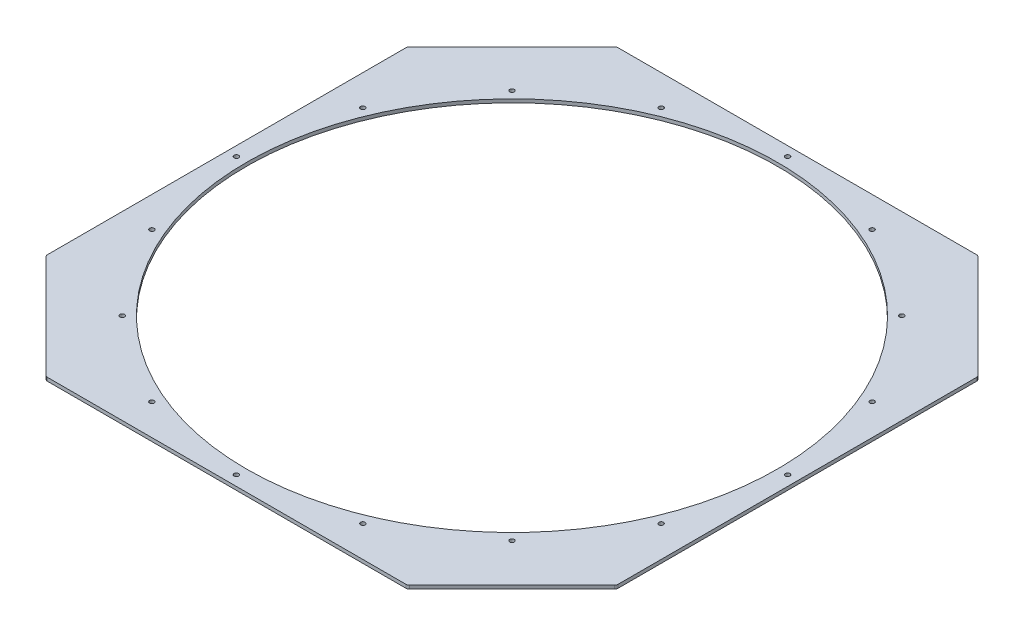
ISO-10303-21;
HEADER;
FILE_DESCRIPTION(('STEP AP214'),'2;1');
FILE_NAME('part.step','',(''),(''),'','','');
FILE_SCHEMA(('AUTOMOTIVE_DESIGN { 1 0 10303 214 1 1 1 1 }'));
ENDSEC;
DATA;
#1=APPLICATION_CONTEXT('core data for automotive mechanical design processes');
#2=APPLICATION_PROTOCOL_DEFINITION('international standard','automotive_design',2000,#1);
#3=PRODUCT_CONTEXT('',#1,'mechanical');
#4=PRODUCT('Part','Part','',(#3));
#5=PRODUCT_RELATED_PRODUCT_CATEGORY('part','',(#4));
#6=PRODUCT_DEFINITION_FORMATION('','',#4);
#7=PRODUCT_DEFINITION_CONTEXT('part definition',#1,'design');
#8=PRODUCT_DEFINITION('design','',#6,#7);
#9=PRODUCT_DEFINITION_SHAPE('','',#8);
#10=(LENGTH_UNIT() NAMED_UNIT(*) SI_UNIT(.MILLI.,.METRE.));
#11=(NAMED_UNIT(*) PLANE_ANGLE_UNIT() SI_UNIT($,.RADIAN.));
#12=(NAMED_UNIT(*) SI_UNIT($,.STERADIAN.) SOLID_ANGLE_UNIT());
#13=UNCERTAINTY_MEASURE_WITH_UNIT(LENGTH_MEASURE(1.E-05),#10,'distance_accuracy_value','');
#14=(GEOMETRIC_REPRESENTATION_CONTEXT(3) GLOBAL_UNCERTAINTY_ASSIGNED_CONTEXT((#13)) GLOBAL_UNIT_ASSIGNED_CONTEXT((#10,
#11,#12)) REPRESENTATION_CONTEXT('',''));
#15=CARTESIAN_POINT('',(0.,0.,0.));
#16=DIRECTION('',(0.,0.,1.));
#17=DIRECTION('',(1.,0.,0.));
#18=AXIS2_PLACEMENT_3D('',#15,#16,#17);
#19=CARTESIAN_POINT('',(-314.066450453871,6.00000000000001,-496.5));
#20=DIRECTION('',(0.,0.,1.));
#21=DIRECTION('',(1.,0.,0.));
#22=AXIS2_PLACEMENT_3D('',#19,#20,#21);
#23=PLANE('',#22);
#24=DIRECTION('',(-1.,0.,0.));
#25=VECTOR('',#24,1.);
#26=CARTESIAN_POINT('',(-314.066450453871,0.,-496.5));
#27=LINE('',#26,#25);
#28=CARTESIAN_POINT('',(312.581169079633,0.,-496.500000000001));
#29=VERTEX_POINT('',#28);
#30=CARTESIAN_POINT('',(-311.581169079633,0.,-496.5));
#31=VERTEX_POINT('',#30);
#32=EDGE_CURVE('E206',#29,#31,#27,.T.);
#33=ORIENTED_EDGE('',*,*,#32,.T.);
#34=DIRECTION('',(0.,-1.,0.));
#35=VECTOR('',#34,1.);
#36=CARTESIAN_POINT('',(-311.581169079633,6.00000000000001,-496.5));
#37=LINE('',#36,#35);
#38=CARTESIAN_POINT('',(-311.581169079633,6.00000000000001,-496.5));
#39=VERTEX_POINT('',#38);
#40=EDGE_CURVE('E257',#31,#39,#37,.F.);
#41=ORIENTED_EDGE('',*,*,#40,.T.);
#42=DIRECTION('',(-1.,0.,0.));
#43=VECTOR('',#42,1.);
#44=CARTESIAN_POINT('',(-314.066450453871,6.00000000000001,-496.5));
#45=LINE('',#44,#43);
#46=CARTESIAN_POINT('',(312.581169079633,6.00000000000001,-496.500000000001));
#47=VERTEX_POINT('',#46);
#48=EDGE_CURVE('E202',#47,#39,#45,.T.);
#49=ORIENTED_EDGE('',*,*,#48,.F.);
#50=DIRECTION('',(0.,-1.,0.));
#51=VECTOR('',#50,1.);
#52=CARTESIAN_POINT('',(312.581169079633,6.00000000000001,-496.500000000001));
#53=LINE('',#52,#51);
#54=EDGE_CURVE('E254',#47,#29,#53,.T.);
#55=ORIENTED_EDGE('',*,*,#54,.T.);
#56=EDGE_LOOP('',(#33,#41,#49,#55));
#57=FACE_BOUND('',#56,.T.);
#58=ADVANCED_FACE('F48',(#57),#23,.F.);
#59=CARTESIAN_POINT('',(-496.5,6.00000000000001,-314.06645045387));
#60=DIRECTION('',(0.707106781186549,0.,0.707106781186546));
#61=DIRECTION('',(0.707106781186546,0.,-0.707106781186549));
#62=AXIS2_PLACEMENT_3D('',#59,#60,#61);
#63=PLANE('',#62);
#64=DIRECTION('',(-0.707106781186546,0.,0.707106781186549));
#65=VECTOR('',#64,1.);
#66=CARTESIAN_POINT('',(-496.5,0.,-314.06645045387));
#67=LINE('',#66,#65);
#68=CARTESIAN_POINT('',(-315.823809766752,0.,-494.742640687119));
#69=VERTEX_POINT('',#68);
#70=CARTESIAN_POINT('',(-494.742640687119,0.,-315.823809766751));
#71=VERTEX_POINT('',#70);
#72=EDGE_CURVE('E294',#69,#71,#67,.T.);
#73=ORIENTED_EDGE('',*,*,#72,.T.);
#74=DIRECTION('',(0.,-1.,0.));
#75=VECTOR('',#74,1.);
#76=CARTESIAN_POINT('',(-494.742640687119,6.00000000000001,-315.823809766751));
#77=LINE('',#76,#75);
#78=CARTESIAN_POINT('',(-494.742640687119,6.00000000000001,-315.823809766751));
#79=VERTEX_POINT('',#78);
#80=EDGE_CURVE('E252',#71,#79,#77,.F.);
#81=ORIENTED_EDGE('',*,*,#80,.T.);
#82=DIRECTION('',(-0.707106781186546,0.,0.707106781186549));
#83=VECTOR('',#82,1.);
#84=CARTESIAN_POINT('',(-496.5,6.00000000000001,-314.06645045387));
#85=LINE('',#84,#83);
#86=CARTESIAN_POINT('',(-315.823809766752,6.00000000000001,-494.742640687119));
#87=VERTEX_POINT('',#86);
#88=EDGE_CURVE('E316',#87,#79,#85,.T.);
#89=ORIENTED_EDGE('',*,*,#88,.F.);
#90=DIRECTION('',(0.,-1.,0.));
#91=VECTOR('',#90,1.);
#92=CARTESIAN_POINT('',(-315.823809766752,6.00000000000001,-494.742640687119));
#93=LINE('',#92,#91);
#94=EDGE_CURVE('E249',#87,#69,#93,.T.);
#95=ORIENTED_EDGE('',*,*,#94,.T.);
#96=EDGE_LOOP('',(#73,#81,#89,#95));
#97=FACE_BOUND('',#96,.T.);
#98=ADVANCED_FACE('F457',(#97),#63,.F.);
#99=CARTESIAN_POINT('',(-496.5,6.00000000000001,315.066450453872));
#100=DIRECTION('',(1.,0.,0.));
#101=DIRECTION('',(0.,0.,-1.));
#102=AXIS2_PLACEMENT_3D('',#99,#100,#101);
#103=PLANE('',#102);
#104=DIRECTION('',(0.,0.,1.));
#105=VECTOR('',#104,1.);
#106=CARTESIAN_POINT('',(-496.5,0.,315.066450453872));
#107=LINE('',#106,#105);
#108=CARTESIAN_POINT('',(-496.5,0.,-311.581169079632));
#109=VERTEX_POINT('',#108);
#110=CARTESIAN_POINT('',(-496.5,0.,312.581169079633));
#111=VERTEX_POINT('',#110);
#112=EDGE_CURVE('E194',#109,#111,#107,.T.);
#113=ORIENTED_EDGE('',*,*,#112,.T.);
#114=DIRECTION('',(0.,-1.,0.));
#115=VECTOR('',#114,1.);
#116=CARTESIAN_POINT('',(-496.5,6.00000000000001,312.581169079633));
#117=LINE('',#116,#115);
#118=CARTESIAN_POINT('',(-496.5,6.00000000000001,312.581169079633));
#119=VERTEX_POINT('',#118);
#120=EDGE_CURVE('E247',#111,#119,#117,.F.);
#121=ORIENTED_EDGE('',*,*,#120,.T.);
#122=DIRECTION('',(0.,0.,1.));
#123=VECTOR('',#122,1.);
#124=CARTESIAN_POINT('',(-496.5,6.00000000000001,315.066450453872));
#125=LINE('',#124,#123);
#126=CARTESIAN_POINT('',(-496.5,6.00000000000001,-311.581169079632));
#127=VERTEX_POINT('',#126);
#128=EDGE_CURVE('E312',#127,#119,#125,.T.);
#129=ORIENTED_EDGE('',*,*,#128,.F.);
#130=DIRECTION('',(0.,-1.,0.));
#131=VECTOR('',#130,1.);
#132=CARTESIAN_POINT('',(-496.5,6.00000000000001,-311.581169079632));
#133=LINE('',#132,#131);
#134=EDGE_CURVE('E244',#127,#109,#133,.T.);
#135=ORIENTED_EDGE('',*,*,#134,.T.);
#136=EDGE_LOOP('',(#113,#121,#129,#135));
#137=FACE_BOUND('',#136,.T.);
#138=ADVANCED_FACE('F300',(#137),#103,.F.);
#139=CARTESIAN_POINT('',(-314.06645045387,6.00000000000001,497.5));
#140=DIRECTION('',(0.707106781186544,0.,-0.707106781186551));
#141=DIRECTION('',(-0.707106781186551,0.,-0.707106781186544));
#142=AXIS2_PLACEMENT_3D('',#139,#140,#141);
#143=PLANE('',#142);
#144=DIRECTION('',(0.707106781186551,0.,0.707106781186544));
#145=VECTOR('',#144,1.);
#146=CARTESIAN_POINT('',(-314.06645045387,0.,497.5));
#147=LINE('',#146,#145);
#148=CARTESIAN_POINT('',(-494.742640687119,0.,316.823809766753));
#149=VERTEX_POINT('',#148);
#150=CARTESIAN_POINT('',(-315.82380976675,0.,495.742640687119));
#151=VERTEX_POINT('',#150);
#152=EDGE_CURVE('E189',#149,#151,#147,.T.);
#153=ORIENTED_EDGE('',*,*,#152,.T.);
#154=DIRECTION('',(0.,-1.,0.));
#155=VECTOR('',#154,1.);
#156=CARTESIAN_POINT('',(-315.82380976675,6.00000000000001,495.742640687119));
#157=LINE('',#156,#155);
#158=CARTESIAN_POINT('',(-315.82380976675,6.00000000000001,495.742640687119));
#159=VERTEX_POINT('',#158);
#160=EDGE_CURVE('E167',#151,#159,#157,.F.);
#161=ORIENTED_EDGE('',*,*,#160,.T.);
#162=DIRECTION('',(0.707106781186551,0.,0.707106781186544));
#163=VECTOR('',#162,1.);
#164=CARTESIAN_POINT('',(-314.06645045387,6.00000000000001,497.5));
#165=LINE('',#164,#163);
#166=CARTESIAN_POINT('',(-494.742640687119,6.00000000000001,316.823809766753));
#167=VERTEX_POINT('',#166);
#168=EDGE_CURVE('E311',#167,#159,#165,.T.);
#169=ORIENTED_EDGE('',*,*,#168,.F.);
#170=DIRECTION('',(0.,-1.,0.));
#171=VECTOR('',#170,1.);
#172=CARTESIAN_POINT('',(-494.742640687119,6.00000000000001,316.823809766753));
#173=LINE('',#172,#171);
#174=EDGE_CURVE('E172',#167,#149,#173,.T.);
#175=ORIENTED_EDGE('',*,*,#174,.T.);
#176=EDGE_LOOP('',(#153,#161,#169,#175));
#177=FACE_BOUND('',#176,.T.);
#178=ADVANCED_FACE('F314',(#177),#143,.F.);
#179=CARTESIAN_POINT('',(-314.06645045387,6.00000000000001,497.5));
#180=DIRECTION('',(0.,0.,-1.));
#181=DIRECTION('',(-1.,0.,0.));
#182=AXIS2_PLACEMENT_3D('',#179,#180,#181);
#183=PLANE('',#182);
#184=DIRECTION('',(1.,0.,0.));
#185=VECTOR('',#184,1.);
#186=CARTESIAN_POINT('',(-314.06645045387,6.00000000000001,497.5));
#187=LINE('',#186,#185);
#188=CARTESIAN_POINT('',(-311.581169079631,6.00000000000001,497.5));
#189=VERTEX_POINT('',#188);
#190=CARTESIAN_POINT('',(312.581169079631,6.00000000000001,497.5));
#191=VERTEX_POINT('',#190);
#192=EDGE_CURVE('E182',#189,#191,#187,.T.);
#193=ORIENTED_EDGE('',*,*,#192,.F.);
#194=DIRECTION('',(0.,-1.,0.));
#195=VECTOR('',#194,1.);
#196=CARTESIAN_POINT('',(-311.581169079631,6.00000000000001,497.5));
#197=LINE('',#196,#195);
#198=CARTESIAN_POINT('',(-311.581169079631,0.,497.5));
#199=VERTEX_POINT('',#198);
#200=EDGE_CURVE('E166',#189,#199,#197,.T.);
#201=ORIENTED_EDGE('',*,*,#200,.T.);
#202=DIRECTION('',(1.,0.,0.));
#203=VECTOR('',#202,1.);
#204=CARTESIAN_POINT('',(-314.06645045387,0.,497.5));
#205=LINE('',#204,#203);
#206=CARTESIAN_POINT('',(312.581169079631,0.,497.5));
#207=VERTEX_POINT('',#206);
#208=EDGE_CURVE('E179',#199,#207,#205,.T.);
#209=ORIENTED_EDGE('',*,*,#208,.T.);
#210=DIRECTION('',(0.,-1.,0.));
#211=VECTOR('',#210,1.);
#212=CARTESIAN_POINT('',(312.581169079631,6.00000000000001,497.5));
#213=LINE('',#212,#211);
#214=EDGE_CURVE('E184',#207,#191,#213,.F.);
#215=ORIENTED_EDGE('',*,*,#214,.T.);
#216=EDGE_LOOP('',(#193,#201,#209,#215));
#217=FACE_BOUND('',#216,.T.);
#218=ADVANCED_FACE('F178',(#217),#183,.F.);
#219=CARTESIAN_POINT('',(497.5,6.00000000000001,315.066450453872));
#220=DIRECTION('',(-0.707106781186544,0.,-0.707106781186551));
#221=DIRECTION('',(-0.707106781186551,0.,0.707106781186544));
#222=AXIS2_PLACEMENT_3D('',#219,#220,#221);
#223=PLANE('',#222);
#224=DIRECTION('',(0.707106781186551,0.,-0.707106781186544));
#225=VECTOR('',#224,1.);
#226=CARTESIAN_POINT('',(497.5,0.,315.066450453872));
#227=LINE('',#226,#225);
#228=CARTESIAN_POINT('',(316.823809766751,0.,495.742640687119));
#229=VERTEX_POINT('',#228);
#230=CARTESIAN_POINT('',(495.742640687119,0.,316.823809766753));
#231=VERTEX_POINT('',#230);
#232=EDGE_CURVE('E188',#229,#231,#227,.T.);
#233=ORIENTED_EDGE('',*,*,#232,.T.);
#234=DIRECTION('',(0.,-1.,0.));
#235=VECTOR('',#234,1.);
#236=CARTESIAN_POINT('',(495.742640687119,6.00000000000001,316.823809766753));
#237=LINE('',#236,#235);
#238=CARTESIAN_POINT('',(495.742640687119,6.00000000000001,316.823809766753));
#239=VERTEX_POINT('',#238);
#240=EDGE_CURVE('E13',#231,#239,#237,.F.);
#241=ORIENTED_EDGE('',*,*,#240,.T.);
#242=DIRECTION('',(0.707106781186551,0.,-0.707106781186544));
#243=VECTOR('',#242,1.);
#244=CARTESIAN_POINT('',(497.5,6.00000000000001,315.066450453872));
#245=LINE('',#244,#243);
#246=CARTESIAN_POINT('',(316.823809766751,6.00000000000001,495.742640687119));
#247=VERTEX_POINT('',#246);
#248=EDGE_CURVE('E274',#247,#239,#245,.T.);
#249=ORIENTED_EDGE('',*,*,#248,.F.);
#250=DIRECTION('',(0.,-1.,0.));
#251=VECTOR('',#250,1.);
#252=CARTESIAN_POINT('',(316.823809766751,6.00000000000001,495.742640687119));
#253=LINE('',#252,#251);
#254=EDGE_CURVE('E56',#247,#229,#253,.T.);
#255=ORIENTED_EDGE('',*,*,#254,.T.);
#256=EDGE_LOOP('',(#233,#241,#249,#255));
#257=FACE_BOUND('',#256,.T.);
#258=ADVANCED_FACE('F271',(#257),#223,.F.);
#259=CARTESIAN_POINT('',(497.5,6.00000000000001,315.066450453872));
#260=DIRECTION('',(-1.,0.,0.));
#261=DIRECTION('',(0.,0.,1.));
#262=AXIS2_PLACEMENT_3D('',#259,#260,#261);
#263=PLANE('',#262);
#264=DIRECTION('',(0.,0.,-1.));
#265=VECTOR('',#264,1.);
#266=CARTESIAN_POINT('',(497.5,0.,315.066450453872));
#267=LINE('',#266,#265);
#268=CARTESIAN_POINT('',(497.5,0.,312.581169079633));
#269=VERTEX_POINT('',#268);
#270=CARTESIAN_POINT('',(497.5,0.,-311.581169079632));
#271=VERTEX_POINT('',#270);
#272=EDGE_CURVE('E192',#269,#271,#267,.T.);
#273=ORIENTED_EDGE('',*,*,#272,.T.);
#274=DIRECTION('',(0.,-1.,0.));
#275=VECTOR('',#274,1.);
#276=CARTESIAN_POINT('',(497.5,6.00000000000001,-311.581169079632));
#277=LINE('',#276,#275);
#278=CARTESIAN_POINT('',(497.5,6.00000000000001,-311.581169079632));
#279=VERTEX_POINT('',#278);
#280=EDGE_CURVE('E266',#271,#279,#277,.F.);
#281=ORIENTED_EDGE('',*,*,#280,.T.);
#282=DIRECTION('',(0.,0.,-1.));
#283=VECTOR('',#282,1.);
#284=CARTESIAN_POINT('',(497.5,6.00000000000001,315.066450453872));
#285=LINE('',#284,#283);
#286=CARTESIAN_POINT('',(497.5,6.00000000000001,312.581169079633));
#287=VERTEX_POINT('',#286);
#288=EDGE_CURVE('E286',#287,#279,#285,.T.);
#289=ORIENTED_EDGE('',*,*,#288,.F.);
#290=DIRECTION('',(0.,-1.,0.));
#291=VECTOR('',#290,1.);
#292=CARTESIAN_POINT('',(497.5,6.00000000000001,312.581169079633));
#293=LINE('',#292,#291);
#294=EDGE_CURVE('E263',#287,#269,#293,.T.);
#295=ORIENTED_EDGE('',*,*,#294,.T.);
#296=EDGE_LOOP('',(#273,#281,#289,#295));
#297=FACE_BOUND('',#296,.T.);
#298=ADVANCED_FACE('F284',(#297),#263,.F.);
#299=CARTESIAN_POINT('',(315.066450453872,6.00000000000001,-496.500000000001));
#300=DIRECTION('',(-0.707106781186551,0.,0.707106781186544));
#301=DIRECTION('',(0.707106781186544,0.,0.707106781186551));
#302=AXIS2_PLACEMENT_3D('',#299,#300,#301);
#303=PLANE('',#302);
#304=DIRECTION('',(-0.707106781186544,0.,-0.707106781186551));
#305=VECTOR('',#304,1.);
#306=CARTESIAN_POINT('',(315.066450453872,0.,-496.500000000001));
#307=LINE('',#306,#305);
#308=CARTESIAN_POINT('',(495.74264068712,0.,-315.823809766751));
#309=VERTEX_POINT('',#308);
#310=CARTESIAN_POINT('',(316.823809766752,0.,-494.74264068712));
#311=VERTEX_POINT('',#310);
#312=EDGE_CURVE('E200',#309,#311,#307,.T.);
#313=ORIENTED_EDGE('',*,*,#312,.T.);
#314=DIRECTION('',(0.,-1.,0.));
#315=VECTOR('',#314,1.);
#316=CARTESIAN_POINT('',(316.823809766752,6.00000000000001,-494.74264068712));
#317=LINE('',#316,#315);
#318=CARTESIAN_POINT('',(316.823809766752,6.00000000000001,-494.74264068712));
#319=VERTEX_POINT('',#318);
#320=EDGE_CURVE('E63',#311,#319,#317,.F.);
#321=ORIENTED_EDGE('',*,*,#320,.T.);
#322=DIRECTION('',(-0.707106781186544,0.,-0.707106781186551));
#323=VECTOR('',#322,1.);
#324=CARTESIAN_POINT('',(315.066450453872,6.00000000000001,-496.500000000001));
#325=LINE('',#324,#323);
#326=CARTESIAN_POINT('',(495.74264068712,6.00000000000001,-315.823809766751));
#327=VERTEX_POINT('',#326);
#328=EDGE_CURVE('E212',#327,#319,#325,.T.);
#329=ORIENTED_EDGE('',*,*,#328,.F.);
#330=DIRECTION('',(0.,-1.,0.));
#331=VECTOR('',#330,1.);
#332=CARTESIAN_POINT('',(495.74264068712,6.00000000000001,-315.823809766751));
#333=LINE('',#332,#331);
#334=EDGE_CURVE('E259',#327,#309,#333,.T.);
#335=ORIENTED_EDGE('',*,*,#334,.T.);
#336=EDGE_LOOP('',(#313,#321,#329,#335));
#337=FACE_BOUND('',#336,.T.);
#338=ADVANCED_FACE('F423',(#337),#303,.F.);
#339=CARTESIAN_POINT('',(0.,6.00000000000001,0.));
#340=DIRECTION('',(0.,1.,0.));
#341=DIRECTION('',(0.,0.,1.));
#342=AXIS2_PLACEMENT_3D('',#339,#340,#341);
#343=PLANE('',#342);
#344=CARTESIAN_POINT('',(-339.411254969543,6.00000000000001,-339.411254969542));
#345=DIRECTION('',(0.,1.,0.));
#346=DIRECTION('',(0.707106781186549,0.,0.707106781186546));
#347=AXIS2_PLACEMENT_3D('',#344,#345,#346);
#348=CIRCLE('',#347,4.);
#349=CARTESIAN_POINT('',(-336.582827844797,6.00000000000001,-336.582827844796));
#350=VERTEX_POINT('',#349);
#351=EDGE_CURVE('E375',#350,#350,#348,.T.);
#352=ORIENTED_EDGE('',*,*,#351,.F.);
#353=EDGE_LOOP('',(#352));
#354=FACE_BOUND('',#353,.T.);
#355=CARTESIAN_POINT('',(-443.462175605418,6.00000000000001,-183.688047535242));
#356=DIRECTION('',(0.,1.,0.));
#357=DIRECTION('',(0.923879532511288,0.,0.382683432365087));
#358=AXIS2_PLACEMENT_3D('',#355,#356,#357);
#359=CIRCLE('',#358,4.);
#360=CARTESIAN_POINT('',(-439.766657475373,6.00000000000001,-182.157313805782));
#361=VERTEX_POINT('',#360);
#362=EDGE_CURVE('E369',#361,#361,#359,.T.);
#363=ORIENTED_EDGE('',*,*,#362,.F.);
#364=EDGE_LOOP('',(#363));
#365=FACE_BOUND('',#364,.T.);
#366=CARTESIAN_POINT('',(-480.,6.00000000000001,1.66533453693773E-12));
#367=DIRECTION('',(0.,1.,0.));
#368=DIRECTION('',(1.,0.,0.));
#369=AXIS2_PLACEMENT_3D('',#366,#367,#368);
#370=CIRCLE('',#369,4.);
#371=CARTESIAN_POINT('',(-476.,6.00000000000001,1.65136861158236E-12));
#372=VERTEX_POINT('',#371);
#373=EDGE_CURVE('E363',#372,#372,#370,.T.);
#374=ORIENTED_EDGE('',*,*,#373,.F.);
#375=EDGE_LOOP('',(#374));
#376=FACE_BOUND('',#375,.T.);
#377=CARTESIAN_POINT('',(-443.462175605417,6.00000000000001,183.688047535245));
#378=DIRECTION('',(0.,1.,0.));
#379=DIRECTION('',(0.923879532511285,0.,-0.382683432365094));
#380=AXIS2_PLACEMENT_3D('',#377,#378,#379);
#381=CIRCLE('',#380,4.);
#382=CARTESIAN_POINT('',(-439.766657475372,6.00000000000001,182.157313805785));
#383=VERTEX_POINT('',#382);
#384=EDGE_CURVE('E357',#383,#383,#381,.T.);
#385=ORIENTED_EDGE('',*,*,#384,.F.);
#386=EDGE_LOOP('',(#385));
#387=FACE_BOUND('',#386,.T.);
#388=CARTESIAN_POINT('',(-339.411254969541,6.00000000000001,339.411254969545));
#389=DIRECTION('',(0.,1.,0.));
#390=DIRECTION('',(0.707106781186544,0.,-0.707106781186551));
#391=AXIS2_PLACEMENT_3D('',#388,#389,#390);
#392=CIRCLE('',#391,4.);
#393=CARTESIAN_POINT('',(-336.582827844795,6.00000000000001,336.582827844799));
#394=VERTEX_POINT('',#393);
#395=EDGE_CURVE('E351',#394,#394,#392,.T.);
#396=ORIENTED_EDGE('',*,*,#395,.F.);
#397=EDGE_LOOP('',(#396));
#398=FACE_BOUND('',#397,.T.);
#399=CARTESIAN_POINT('',(-183.68804753524,6.00000000000001,443.462175605419));
#400=DIRECTION('',(0.,1.,0.));
#401=DIRECTION('',(0.382683432365084,0.,-0.923879532511289));
#402=AXIS2_PLACEMENT_3D('',#399,#400,#401);
#403=CIRCLE('',#402,4.);
#404=CARTESIAN_POINT('',(-182.15731380578,6.00000000000001,439.766657475374));
#405=VERTEX_POINT('',#404);
#406=EDGE_CURVE('E345',#405,#405,#403,.T.);
#407=ORIENTED_EDGE('',*,*,#406,.F.);
#408=EDGE_LOOP('',(#407));
#409=FACE_BOUND('',#408,.T.);
#410=CARTESIAN_POINT('',(0.,6.00000000000001,480.));
#411=DIRECTION('',(0.,1.,0.));
#412=DIRECTION('',(0.,0.,-1.));
#413=AXIS2_PLACEMENT_3D('',#410,#411,#412);
#414=CIRCLE('',#413,4.);
#415=CARTESIAN_POINT('',(0.,6.00000000000001,476.));
#416=VERTEX_POINT('',#415);
#417=EDGE_CURVE('E337',#416,#416,#414,.T.);
#418=ORIENTED_EDGE('',*,*,#417,.F.);
#419=EDGE_LOOP('',(#418));
#420=FACE_BOUND('',#419,.T.);
#421=CARTESIAN_POINT('',(183.688047535247,6.00000000000001,443.462175605416));
#422=DIRECTION('',(0.,1.,0.));
#423=DIRECTION('',(-0.382683432365097,0.,-0.923879532511284));
#424=AXIS2_PLACEMENT_3D('',#421,#422,#423);
#425=CIRCLE('',#424,4.);
#426=CARTESIAN_POINT('',(182.157313805786,6.00000000000001,439.766657475371));
#427=VERTEX_POINT('',#426);
#428=EDGE_CURVE('E338',#427,#427,#425,.T.);
#429=ORIENTED_EDGE('',*,*,#428,.F.);
#430=EDGE_LOOP('',(#429));
#431=FACE_BOUND('',#430,.T.);
#432=CARTESIAN_POINT('',(339.411254969546,6.00000000000001,339.41125496954));
#433=DIRECTION('',(0.,1.,0.));
#434=DIRECTION('',(-0.707106781186554,0.,-0.707106781186541));
#435=AXIS2_PLACEMENT_3D('',#432,#433,#434);
#436=CIRCLE('',#435,4.);
#437=CARTESIAN_POINT('',(336.5828278448,6.00000000000001,336.582827844794));
#438=VERTEX_POINT('',#437);
#439=EDGE_CURVE('E410',#438,#438,#436,.T.);
#440=ORIENTED_EDGE('',*,*,#439,.F.);
#441=EDGE_LOOP('',(#440));
#442=FACE_BOUND('',#441,.T.);
#443=CARTESIAN_POINT('',(443.46217560542,6.00000000000001,183.688047535239));
#444=DIRECTION('',(0.,1.,0.));
#445=DIRECTION('',(-0.923879532511291,0.,-0.382683432365081));
#446=AXIS2_PLACEMENT_3D('',#443,#444,#445);
#447=CIRCLE('',#446,4.);
#448=CARTESIAN_POINT('',(439.766657475374,6.00000000000001,182.157313805778));
#449=VERTEX_POINT('',#448);
#450=EDGE_CURVE('E404',#449,#449,#447,.T.);
#451=ORIENTED_EDGE('',*,*,#450,.F.);
#452=EDGE_LOOP('',(#451));
#453=FACE_BOUND('',#452,.T.);
#454=CARTESIAN_POINT('',(480.,6.00000000000001,-4.9960036108132E-12));
#455=DIRECTION('',(0.,1.,0.));
#456=DIRECTION('',(-1.,0.,0.));
#457=AXIS2_PLACEMENT_3D('',#454,#455,#456);
#458=CIRCLE('',#457,4.);
#459=CARTESIAN_POINT('',(476.,6.00000000000001,-4.95410583474709E-12));
#460=VERTEX_POINT('',#459);
#461=EDGE_CURVE('E398',#460,#460,#458,.T.);
#462=ORIENTED_EDGE('',*,*,#461,.F.);
#463=EDGE_LOOP('',(#462));
#464=FACE_BOUND('',#463,.T.);
#465=CARTESIAN_POINT('',(443.462175605416,6.00000000000001,-183.688047535248));
#466=DIRECTION('',(0.,1.,0.));
#467=DIRECTION('',(-0.923879532511283,0.,0.3826834323651));
#468=AXIS2_PLACEMENT_3D('',#465,#466,#467);
#469=CIRCLE('',#468,4.);
#470=CARTESIAN_POINT('',(439.76665747537,6.00000000000001,-182.157313805788));
#471=VERTEX_POINT('',#470);
#472=EDGE_CURVE('E392',#471,#471,#469,.T.);
#473=ORIENTED_EDGE('',*,*,#472,.F.);
#474=EDGE_LOOP('',(#473));
#475=FACE_BOUND('',#474,.T.);
#476=CARTESIAN_POINT('',(339.411254969539,6.00000000000001,-339.411254969547));
#477=DIRECTION('',(0.,1.,0.));
#478=DIRECTION('',(-0.707106781186539,0.,0.707106781186556));
#479=AXIS2_PLACEMENT_3D('',#476,#477,#478);
#480=CIRCLE('',#479,4.);
#481=CARTESIAN_POINT('',(336.582827844792,6.00000000000001,-336.582827844801));
#482=VERTEX_POINT('',#481);
#483=EDGE_CURVE('E385',#482,#482,#480,.T.);
#484=ORIENTED_EDGE('',*,*,#483,.F.);
#485=EDGE_LOOP('',(#484));
#486=FACE_BOUND('',#485,.T.);
#487=CARTESIAN_POINT('',(183.688047535237,6.00000000000001,-443.46217560542));
#488=DIRECTION('',(0.,1.,0.));
#489=DIRECTION('',(-0.382683432365077,0.,0.923879532511292));
#490=AXIS2_PLACEMENT_3D('',#487,#488,#489);
#491=CIRCLE('',#490,4.);
#492=CARTESIAN_POINT('',(182.157313805777,6.00000000000001,-439.766657475375));
#493=VERTEX_POINT('',#492);
#494=EDGE_CURVE('E386',#493,#493,#491,.T.);
#495=ORIENTED_EDGE('',*,*,#494,.F.);
#496=EDGE_LOOP('',(#495));
#497=FACE_BOUND('',#496,.T.);
#498=CARTESIAN_POINT('',(-183.688047535244,6.00000000000001,-443.462175605418));
#499=DIRECTION('',(0.,1.,0.));
#500=DIRECTION('',(0.382683432365091,0.,0.923879532511287));
#501=AXIS2_PLACEMENT_3D('',#498,#499,#500);
#502=CIRCLE('',#501,4.);
#503=CARTESIAN_POINT('',(-182.157313805783,6.00000000000001,-439.766657475372));
#504=VERTEX_POINT('',#503);
#505=EDGE_CURVE('E330',#504,#504,#502,.T.);
#506=ORIENTED_EDGE('',*,*,#505,.F.);
#507=EDGE_LOOP('',(#506));
#508=FACE_BOUND('',#507,.T.);
#509=CARTESIAN_POINT('',(0.,6.00000000000001,-480.));
#510=DIRECTION('',(0.,1.,0.));
#511=DIRECTION('',(0.,0.,1.));
#512=AXIS2_PLACEMENT_3D('',#509,#510,#511);
#513=CIRCLE('',#512,4.);
#514=CARTESIAN_POINT('',(0.,6.00000000000001,-476.));
#515=VERTEX_POINT('',#514);
#516=EDGE_CURVE('E211',#515,#515,#513,.T.);
#517=ORIENTED_EDGE('',*,*,#516,.F.);
#518=EDGE_LOOP('',(#517));
#519=FACE_BOUND('',#518,.T.);
#520=CARTESIAN_POINT('',(0.,6.00000000000001,0.));
#521=DIRECTION('',(0.,1.,0.));
#522=DIRECTION('',(0.,0.,1.));
#523=AXIS2_PLACEMENT_3D('',#520,#521,#522);
#524=CIRCLE('',#523,462.5);
#525=CARTESIAN_POINT('',(0.,6.00000000000001,462.5));
#526=VERTEX_POINT('',#525);
#527=EDGE_CURVE('E207',#526,#526,#524,.T.);
#528=ORIENTED_EDGE('',*,*,#527,.F.);
#529=EDGE_LOOP('',(#528));
#530=FACE_BOUND('',#529,.T.);
#531=ORIENTED_EDGE('',*,*,#168,.T.);
#532=CARTESIAN_POINT('',(-311.581169079631,6.00000000000001,491.5));
#533=DIRECTION('',(0.,1.,0.));
#534=DIRECTION('',(0.,0.,1.));
#535=AXIS2_PLACEMENT_3D('',#532,#533,#534);
#536=CIRCLE('',#535,6.);
#537=EDGE_CURVE('E242',#159,#189,#536,.T.);
#538=ORIENTED_EDGE('',*,*,#537,.T.);
#539=ORIENTED_EDGE('',*,*,#192,.T.);
#540=CARTESIAN_POINT('',(312.581169079631,6.00000000000001,491.5));
#541=DIRECTION('',(0.,1.,0.));
#542=DIRECTION('',(0.,0.,1.));
#543=AXIS2_PLACEMENT_3D('',#540,#541,#542);
#544=CIRCLE('',#543,6.);
#545=EDGE_CURVE('E229',#191,#247,#544,.T.);
#546=ORIENTED_EDGE('',*,*,#545,.T.);
#547=ORIENTED_EDGE('',*,*,#248,.T.);
#548=CARTESIAN_POINT('',(491.5,6.00000000000001,312.581169079633));
#549=DIRECTION('',(0.,1.,0.));
#550=DIRECTION('',(0.,0.,1.));
#551=AXIS2_PLACEMENT_3D('',#548,#549,#550);
#552=CIRCLE('',#551,6.);
#553=EDGE_CURVE('E231',#239,#287,#552,.T.);
#554=ORIENTED_EDGE('',*,*,#553,.T.);
#555=ORIENTED_EDGE('',*,*,#288,.T.);
#556=CARTESIAN_POINT('',(491.5,6.00000000000001,-311.581169079632));
#557=DIRECTION('',(0.,1.,0.));
#558=DIRECTION('',(0.,0.,1.));
#559=AXIS2_PLACEMENT_3D('',#556,#557,#558);
#560=CIRCLE('',#559,6.);
#561=EDGE_CURVE('E70',#279,#327,#560,.T.);
#562=ORIENTED_EDGE('',*,*,#561,.T.);
#563=ORIENTED_EDGE('',*,*,#328,.T.);
#564=CARTESIAN_POINT('',(312.581169079633,6.00000000000001,-490.500000000001));
#565=DIRECTION('',(0.,1.,0.));
#566=DIRECTION('',(0.,0.,1.));
#567=AXIS2_PLACEMENT_3D('',#564,#565,#566);
#568=CIRCLE('',#567,6.);
#569=EDGE_CURVE('E234',#319,#47,#568,.T.);
#570=ORIENTED_EDGE('',*,*,#569,.T.);
#571=ORIENTED_EDGE('',*,*,#48,.T.);
#572=CARTESIAN_POINT('',(-311.581169079633,6.00000000000001,-490.5));
#573=DIRECTION('',(0.,1.,0.));
#574=DIRECTION('',(0.,0.,1.));
#575=AXIS2_PLACEMENT_3D('',#572,#573,#574);
#576=CIRCLE('',#575,6.);
#577=EDGE_CURVE('E236',#39,#87,#576,.T.);
#578=ORIENTED_EDGE('',*,*,#577,.T.);
#579=ORIENTED_EDGE('',*,*,#88,.T.);
#580=CARTESIAN_POINT('',(-490.5,6.00000000000001,-311.581169079632));
#581=DIRECTION('',(0.,1.,0.));
#582=DIRECTION('',(0.,0.,1.));
#583=AXIS2_PLACEMENT_3D('',#580,#581,#582);
#584=CIRCLE('',#583,6.);
#585=EDGE_CURVE('E238',#79,#127,#584,.T.);
#586=ORIENTED_EDGE('',*,*,#585,.T.);
#587=ORIENTED_EDGE('',*,*,#128,.T.);
#588=CARTESIAN_POINT('',(-490.5,6.00000000000001,312.581169079633));
#589=DIRECTION('',(0.,1.,0.));
#590=DIRECTION('',(0.,0.,1.));
#591=AXIS2_PLACEMENT_3D('',#588,#589,#590);
#592=CIRCLE('',#591,6.);
#593=EDGE_CURVE('E240',#119,#167,#592,.T.);
#594=ORIENTED_EDGE('',*,*,#593,.T.);
#595=EDGE_LOOP('',(#531,#538,#539,#546,#547,#554,#555,#562,#563,#570,#571,#578,#579,#586,#587,#594));
#596=FACE_BOUND('',#595,.T.);
#597=ADVANCED_FACE('F310',(#354,#365,#376,#387,#398,#409,#420,#431,#442,#453,#464,#475,#486,
#497,#508,#519,#530,#596),#343,.T.);
#598=CARTESIAN_POINT('',(0.,0.,0.));
#599=DIRECTION('',(0.,1.,0.));
#600=DIRECTION('',(0.,0.,1.));
#601=AXIS2_PLACEMENT_3D('',#598,#599,#600);
#602=PLANE('',#601);
#603=CARTESIAN_POINT('',(-339.411254969543,0.,-339.411254969542));
#604=DIRECTION('',(0.,1.,0.));
#605=DIRECTION('',(0.707106781186549,0.,0.707106781186546));
#606=AXIS2_PLACEMENT_3D('',#603,#604,#605);
#607=CIRCLE('',#606,4.);
#608=CARTESIAN_POINT('',(-336.582827844797,0.,-336.582827844796));
#609=VERTEX_POINT('',#608);
#610=EDGE_CURVE('E333',#609,#609,#607,.T.);
#611=ORIENTED_EDGE('',*,*,#610,.T.);
#612=EDGE_LOOP('',(#611));
#613=FACE_BOUND('',#612,.T.);
#614=CARTESIAN_POINT('',(-443.462175605418,0.,-183.688047535242));
#615=DIRECTION('',(0.,1.,0.));
#616=DIRECTION('',(0.923879532511288,0.,0.382683432365087));
#617=AXIS2_PLACEMENT_3D('',#614,#615,#616);
#618=CIRCLE('',#617,4.);
#619=CARTESIAN_POINT('',(-439.766657475373,0.,-182.157313805782));
#620=VERTEX_POINT('',#619);
#621=EDGE_CURVE('E372',#620,#620,#618,.T.);
#622=ORIENTED_EDGE('',*,*,#621,.T.);
#623=EDGE_LOOP('',(#622));
#624=FACE_BOUND('',#623,.T.);
#625=CARTESIAN_POINT('',(-480.,0.,1.66533453693773E-12));
#626=DIRECTION('',(0.,1.,0.));
#627=DIRECTION('',(1.,0.,0.));
#628=AXIS2_PLACEMENT_3D('',#625,#626,#627);
#629=CIRCLE('',#628,4.);
#630=CARTESIAN_POINT('',(-476.,0.,1.65136861158236E-12));
#631=VERTEX_POINT('',#630);
#632=EDGE_CURVE('E366',#631,#631,#629,.T.);
#633=ORIENTED_EDGE('',*,*,#632,.T.);
#634=EDGE_LOOP('',(#633));
#635=FACE_BOUND('',#634,.T.);
#636=CARTESIAN_POINT('',(-443.462175605417,0.,183.688047535245));
#637=DIRECTION('',(0.,1.,0.));
#638=DIRECTION('',(0.923879532511285,0.,-0.382683432365094));
#639=AXIS2_PLACEMENT_3D('',#636,#637,#638);
#640=CIRCLE('',#639,4.);
#641=CARTESIAN_POINT('',(-439.766657475372,0.,182.157313805785));
#642=VERTEX_POINT('',#641);
#643=EDGE_CURVE('E360',#642,#642,#640,.T.);
#644=ORIENTED_EDGE('',*,*,#643,.T.);
#645=EDGE_LOOP('',(#644));
#646=FACE_BOUND('',#645,.T.);
#647=CARTESIAN_POINT('',(-339.411254969541,0.,339.411254969545));
#648=DIRECTION('',(0.,1.,0.));
#649=DIRECTION('',(0.707106781186544,0.,-0.707106781186551));
#650=AXIS2_PLACEMENT_3D('',#647,#648,#649);
#651=CIRCLE('',#650,4.);
#652=CARTESIAN_POINT('',(-336.582827844795,0.,336.582827844799));
#653=VERTEX_POINT('',#652);
#654=EDGE_CURVE('E354',#653,#653,#651,.T.);
#655=ORIENTED_EDGE('',*,*,#654,.T.);
#656=EDGE_LOOP('',(#655));
#657=FACE_BOUND('',#656,.T.);
#658=CARTESIAN_POINT('',(-183.68804753524,0.,443.462175605419));
#659=DIRECTION('',(0.,1.,0.));
#660=DIRECTION('',(0.382683432365084,0.,-0.923879532511289));
#661=AXIS2_PLACEMENT_3D('',#658,#659,#660);
#662=CIRCLE('',#661,4.);
#663=CARTESIAN_POINT('',(-182.15731380578,0.,439.766657475374));
#664=VERTEX_POINT('',#663);
#665=EDGE_CURVE('E348',#664,#664,#662,.T.);
#666=ORIENTED_EDGE('',*,*,#665,.T.);
#667=EDGE_LOOP('',(#666));
#668=FACE_BOUND('',#667,.T.);
#669=CARTESIAN_POINT('',(0.,0.,480.));
#670=DIRECTION('',(0.,1.,0.));
#671=DIRECTION('',(0.,0.,-1.));
#672=AXIS2_PLACEMENT_3D('',#669,#670,#671);
#673=CIRCLE('',#672,4.);
#674=CARTESIAN_POINT('',(0.,0.,476.));
#675=VERTEX_POINT('',#674);
#676=EDGE_CURVE('E342',#675,#675,#673,.T.);
#677=ORIENTED_EDGE('',*,*,#676,.T.);
#678=EDGE_LOOP('',(#677));
#679=FACE_BOUND('',#678,.T.);
#680=CARTESIAN_POINT('',(183.688047535247,0.,443.462175605416));
#681=DIRECTION('',(0.,1.,0.));
#682=DIRECTION('',(-0.382683432365097,0.,-0.923879532511284));
#683=AXIS2_PLACEMENT_3D('',#680,#681,#682);
#684=CIRCLE('',#683,4.);
#685=CARTESIAN_POINT('',(182.157313805786,0.,439.766657475371));
#686=VERTEX_POINT('',#685);
#687=EDGE_CURVE('E334',#686,#686,#684,.T.);
#688=ORIENTED_EDGE('',*,*,#687,.T.);
#689=EDGE_LOOP('',(#688));
#690=FACE_BOUND('',#689,.T.);
#691=CARTESIAN_POINT('',(339.411254969546,0.,339.41125496954));
#692=DIRECTION('',(0.,1.,0.));
#693=DIRECTION('',(-0.707106781186554,0.,-0.707106781186541));
#694=AXIS2_PLACEMENT_3D('',#691,#692,#693);
#695=CIRCLE('',#694,4.);
#696=CARTESIAN_POINT('',(336.5828278448,0.,336.582827844794));
#697=VERTEX_POINT('',#696);
#698=EDGE_CURVE('E341',#697,#697,#695,.T.);
#699=ORIENTED_EDGE('',*,*,#698,.T.);
#700=EDGE_LOOP('',(#699));
#701=FACE_BOUND('',#700,.T.);
#702=CARTESIAN_POINT('',(443.46217560542,0.,183.688047535239));
#703=DIRECTION('',(0.,1.,0.));
#704=DIRECTION('',(-0.923879532511291,0.,-0.382683432365081));
#705=AXIS2_PLACEMENT_3D('',#702,#703,#704);
#706=CIRCLE('',#705,4.);
#707=CARTESIAN_POINT('',(439.766657475374,0.,182.157313805778));
#708=VERTEX_POINT('',#707);
#709=EDGE_CURVE('E407',#708,#708,#706,.T.);
#710=ORIENTED_EDGE('',*,*,#709,.T.);
#711=EDGE_LOOP('',(#710));
#712=FACE_BOUND('',#711,.T.);
#713=CARTESIAN_POINT('',(480.,0.,-4.9960036108132E-12));
#714=DIRECTION('',(0.,1.,0.));
#715=DIRECTION('',(-1.,0.,0.));
#716=AXIS2_PLACEMENT_3D('',#713,#714,#715);
#717=CIRCLE('',#716,4.);
#718=CARTESIAN_POINT('',(476.,0.,-4.95410583474709E-12));
#719=VERTEX_POINT('',#718);
#720=EDGE_CURVE('E401',#719,#719,#717,.T.);
#721=ORIENTED_EDGE('',*,*,#720,.T.);
#722=EDGE_LOOP('',(#721));
#723=FACE_BOUND('',#722,.T.);
#724=CARTESIAN_POINT('',(443.462175605416,0.,-183.688047535248));
#725=DIRECTION('',(0.,1.,0.));
#726=DIRECTION('',(-0.923879532511283,0.,0.3826834323651));
#727=AXIS2_PLACEMENT_3D('',#724,#725,#726);
#728=CIRCLE('',#727,4.);
#729=CARTESIAN_POINT('',(439.76665747537,0.,-182.157313805788));
#730=VERTEX_POINT('',#729);
#731=EDGE_CURVE('E395',#730,#730,#728,.T.);
#732=ORIENTED_EDGE('',*,*,#731,.T.);
#733=EDGE_LOOP('',(#732));
#734=FACE_BOUND('',#733,.T.);
#735=CARTESIAN_POINT('',(339.411254969539,0.,-339.411254969547));
#736=DIRECTION('',(0.,1.,0.));
#737=DIRECTION('',(-0.707106781186539,0.,0.707106781186556));
#738=AXIS2_PLACEMENT_3D('',#735,#736,#737);
#739=CIRCLE('',#738,4.);
#740=CARTESIAN_POINT('',(336.582827844792,0.,-336.582827844801));
#741=VERTEX_POINT('',#740);
#742=EDGE_CURVE('E389',#741,#741,#739,.T.);
#743=ORIENTED_EDGE('',*,*,#742,.T.);
#744=EDGE_LOOP('',(#743));
#745=FACE_BOUND('',#744,.T.);
#746=CARTESIAN_POINT('',(183.688047535237,0.,-443.46217560542));
#747=DIRECTION('',(0.,1.,0.));
#748=DIRECTION('',(-0.382683432365077,0.,0.923879532511292));
#749=AXIS2_PLACEMENT_3D('',#746,#747,#748);
#750=CIRCLE('',#749,4.);
#751=CARTESIAN_POINT('',(182.157313805777,0.,-439.766657475375));
#752=VERTEX_POINT('',#751);
#753=EDGE_CURVE('E382',#752,#752,#750,.T.);
#754=ORIENTED_EDGE('',*,*,#753,.T.);
#755=EDGE_LOOP('',(#754));
#756=FACE_BOUND('',#755,.T.);
#757=CARTESIAN_POINT('',(-183.688047535244,0.,-443.462175605418));
#758=DIRECTION('',(0.,1.,0.));
#759=DIRECTION('',(0.382683432365091,0.,0.923879532511287));
#760=AXIS2_PLACEMENT_3D('',#757,#758,#759);
#761=CIRCLE('',#760,4.);
#762=CARTESIAN_POINT('',(-182.157313805783,0.,-439.766657475372));
#763=VERTEX_POINT('',#762);
#764=EDGE_CURVE('E327',#763,#763,#761,.T.);
#765=ORIENTED_EDGE('',*,*,#764,.T.);
#766=EDGE_LOOP('',(#765));
#767=FACE_BOUND('',#766,.T.);
#768=CARTESIAN_POINT('',(0.,0.,-480.));
#769=DIRECTION('',(0.,1.,0.));
#770=DIRECTION('',(0.,0.,1.));
#771=AXIS2_PLACEMENT_3D('',#768,#769,#770);
#772=CIRCLE('',#771,4.);
#773=CARTESIAN_POINT('',(0.,0.,-476.));
#774=VERTEX_POINT('',#773);
#775=EDGE_CURVE('E208',#774,#774,#772,.T.);
#776=ORIENTED_EDGE('',*,*,#775,.T.);
#777=EDGE_LOOP('',(#776));
#778=FACE_BOUND('',#777,.T.);
#779=CARTESIAN_POINT('',(0.,0.,0.));
#780=DIRECTION('',(0.,1.,0.));
#781=DIRECTION('',(0.,0.,1.));
#782=AXIS2_PLACEMENT_3D('',#779,#780,#781);
#783=CIRCLE('',#782,462.5);
#784=CARTESIAN_POINT('',(0.,0.,462.5));
#785=VERTEX_POINT('',#784);
#786=EDGE_CURVE('E203',#785,#785,#783,.T.);
#787=ORIENTED_EDGE('',*,*,#786,.T.);
#788=EDGE_LOOP('',(#787));
#789=FACE_BOUND('',#788,.T.);
#790=ORIENTED_EDGE('',*,*,#208,.F.);
#791=CARTESIAN_POINT('',(-311.581169079631,0.,491.5));
#792=DIRECTION('',(0.,1.,0.));
#793=DIRECTION('',(0.,0.,1.));
#794=AXIS2_PLACEMENT_3D('',#791,#792,#793);
#795=CIRCLE('',#794,6.);
#796=EDGE_CURVE('E162',#199,#151,#795,.F.);
#797=ORIENTED_EDGE('',*,*,#796,.T.);
#798=ORIENTED_EDGE('',*,*,#152,.F.);
#799=CARTESIAN_POINT('',(-490.5,0.,312.581169079633));
#800=DIRECTION('',(0.,1.,0.));
#801=DIRECTION('',(0.,0.,1.));
#802=AXIS2_PLACEMENT_3D('',#799,#800,#801);
#803=CIRCLE('',#802,6.);
#804=EDGE_CURVE('E173',#149,#111,#803,.F.);
#805=ORIENTED_EDGE('',*,*,#804,.T.);
#806=ORIENTED_EDGE('',*,*,#112,.F.);
#807=CARTESIAN_POINT('',(-490.5,0.,-311.581169079632));
#808=DIRECTION('',(0.,1.,0.));
#809=DIRECTION('',(0.,0.,1.));
#810=AXIS2_PLACEMENT_3D('',#807,#808,#809);
#811=CIRCLE('',#810,6.);
#812=EDGE_CURVE('E223',#109,#71,#811,.F.);
#813=ORIENTED_EDGE('',*,*,#812,.T.);
#814=ORIENTED_EDGE('',*,*,#72,.F.);
#815=CARTESIAN_POINT('',(-311.581169079633,0.,-490.5));
#816=DIRECTION('',(0.,1.,0.));
#817=DIRECTION('',(0.,0.,1.));
#818=AXIS2_PLACEMENT_3D('',#815,#816,#817);
#819=CIRCLE('',#818,6.);
#820=EDGE_CURVE('E221',#69,#31,#819,.F.);
#821=ORIENTED_EDGE('',*,*,#820,.T.);
#822=ORIENTED_EDGE('',*,*,#32,.F.);
#823=CARTESIAN_POINT('',(312.581169079633,0.,-490.500000000001));
#824=DIRECTION('',(0.,1.,0.));
#825=DIRECTION('',(0.,0.,1.));
#826=AXIS2_PLACEMENT_3D('',#823,#824,#825);
#827=CIRCLE('',#826,6.);
#828=EDGE_CURVE('E219',#29,#311,#827,.F.);
#829=ORIENTED_EDGE('',*,*,#828,.T.);
#830=ORIENTED_EDGE('',*,*,#312,.F.);
#831=CARTESIAN_POINT('',(491.5,0.,-311.581169079632));
#832=DIRECTION('',(0.,1.,0.));
#833=DIRECTION('',(0.,0.,1.));
#834=AXIS2_PLACEMENT_3D('',#831,#832,#833);
#835=CIRCLE('',#834,6.);
#836=EDGE_CURVE('E217',#309,#271,#835,.F.);
#837=ORIENTED_EDGE('',*,*,#836,.T.);
#838=ORIENTED_EDGE('',*,*,#272,.F.);
#839=CARTESIAN_POINT('',(491.5,0.,312.581169079633));
#840=DIRECTION('',(0.,1.,0.));
#841=DIRECTION('',(0.,0.,1.));
#842=AXIS2_PLACEMENT_3D('',#839,#840,#841);
#843=CIRCLE('',#842,6.);
#844=EDGE_CURVE('E215',#269,#231,#843,.F.);
#845=ORIENTED_EDGE('',*,*,#844,.T.);
#846=ORIENTED_EDGE('',*,*,#232,.F.);
#847=CARTESIAN_POINT('',(312.581169079631,0.,491.5));
#848=DIRECTION('',(0.,1.,0.));
#849=DIRECTION('',(0.,0.,1.));
#850=AXIS2_PLACEMENT_3D('',#847,#848,#849);
#851=CIRCLE('',#850,6.);
#852=EDGE_CURVE('E183',#229,#207,#851,.F.);
#853=ORIENTED_EDGE('',*,*,#852,.T.);
#854=EDGE_LOOP('',(#790,#797,#798,#805,#806,#813,#814,#821,#822,#829,#830,#837,#838,#845,#846,#853));
#855=FACE_BOUND('',#854,.T.);
#856=ADVANCED_FACE('F186',(#613,#624,#635,#646,#657,#668,#679,#690,#701,#712,#723,#734,#745,
#756,#767,#778,#789,#855),#602,.F.);
#857=CARTESIAN_POINT('',(0.,-4.,0.));
#858=DIRECTION('',(0.,1.,0.));
#859=DIRECTION('',(0.,0.,1.));
#860=AXIS2_PLACEMENT_3D('',#857,#858,#859);
#861=CYLINDRICAL_SURFACE('',#860,462.5);
#862=ORIENTED_EDGE('',*,*,#527,.T.);
#863=EDGE_LOOP('',(#862));
#864=FACE_BOUND('',#863,.T.);
#865=ORIENTED_EDGE('',*,*,#786,.F.);
#866=EDGE_LOOP('',(#865));
#867=FACE_BOUND('',#866,.T.);
#868=ADVANCED_FACE('F442',(#864,#867),#861,.F.);
#869=CARTESIAN_POINT('',(0.,-4.,-480.));
#870=DIRECTION('',(0.,1.,0.));
#871=DIRECTION('',(0.,0.,1.));
#872=AXIS2_PLACEMENT_3D('',#869,#870,#871);
#873=CYLINDRICAL_SURFACE('',#872,4.);
#874=ORIENTED_EDGE('',*,*,#516,.T.);
#875=EDGE_LOOP('',(#874));
#876=FACE_BOUND('',#875,.T.);
#877=ORIENTED_EDGE('',*,*,#775,.F.);
#878=EDGE_LOOP('',(#877));
#879=FACE_BOUND('',#878,.T.);
#880=ADVANCED_FACE('F445',(#876,#879),#873,.F.);
#881=CARTESIAN_POINT('',(-183.688047535244,-4.,-443.462175605418));
#882=DIRECTION('',(0.,1.,0.));
#883=DIRECTION('',(0.382683432365091,0.,0.923879532511287));
#884=AXIS2_PLACEMENT_3D('',#881,#882,#883);
#885=CYLINDRICAL_SURFACE('',#884,4.);
#886=ORIENTED_EDGE('',*,*,#505,.T.);
#887=EDGE_LOOP('',(#886));
#888=FACE_BOUND('',#887,.T.);
#889=ORIENTED_EDGE('',*,*,#764,.F.);
#890=EDGE_LOOP('',(#889));
#891=FACE_BOUND('',#890,.T.);
#892=ADVANCED_FACE('F628',(#888,#891),#885,.F.);
#893=CARTESIAN_POINT('',(183.688047535237,-4.,-443.46217560542));
#894=DIRECTION('',(0.,1.,0.));
#895=DIRECTION('',(-0.382683432365077,0.,0.923879532511292));
#896=AXIS2_PLACEMENT_3D('',#893,#894,#895);
#897=CYLINDRICAL_SURFACE('',#896,4.);
#898=ORIENTED_EDGE('',*,*,#494,.T.);
#899=EDGE_LOOP('',(#898));
#900=FACE_BOUND('',#899,.T.);
#901=ORIENTED_EDGE('',*,*,#753,.F.);
#902=EDGE_LOOP('',(#901));
#903=FACE_BOUND('',#902,.T.);
#904=ADVANCED_FACE('F620',(#900,#903),#897,.F.);
#905=CARTESIAN_POINT('',(339.411254969539,-4.,-339.411254969547));
#906=DIRECTION('',(0.,1.,0.));
#907=DIRECTION('',(-0.707106781186539,0.,0.707106781186556));
#908=AXIS2_PLACEMENT_3D('',#905,#906,#907);
#909=CYLINDRICAL_SURFACE('',#908,4.);
#910=ORIENTED_EDGE('',*,*,#483,.T.);
#911=EDGE_LOOP('',(#910));
#912=FACE_BOUND('',#911,.T.);
#913=ORIENTED_EDGE('',*,*,#742,.F.);
#914=EDGE_LOOP('',(#913));
#915=FACE_BOUND('',#914,.T.);
#916=ADVANCED_FACE('F612',(#912,#915),#909,.F.);
#917=CARTESIAN_POINT('',(443.462175605416,-4.,-183.688047535248));
#918=DIRECTION('',(0.,1.,0.));
#919=DIRECTION('',(-0.923879532511283,0.,0.3826834323651));
#920=AXIS2_PLACEMENT_3D('',#917,#918,#919);
#921=CYLINDRICAL_SURFACE('',#920,4.);
#922=ORIENTED_EDGE('',*,*,#472,.T.);
#923=EDGE_LOOP('',(#922));
#924=FACE_BOUND('',#923,.T.);
#925=ORIENTED_EDGE('',*,*,#731,.F.);
#926=EDGE_LOOP('',(#925));
#927=FACE_BOUND('',#926,.T.);
#928=ADVANCED_FACE('F604',(#924,#927),#921,.F.);
#929=CARTESIAN_POINT('',(480.,-4.,-4.9960036108132E-12));
#930=DIRECTION('',(0.,1.,0.));
#931=DIRECTION('',(-1.,0.,0.));
#932=AXIS2_PLACEMENT_3D('',#929,#930,#931);
#933=CYLINDRICAL_SURFACE('',#932,4.);
#934=ORIENTED_EDGE('',*,*,#461,.T.);
#935=EDGE_LOOP('',(#934));
#936=FACE_BOUND('',#935,.T.);
#937=ORIENTED_EDGE('',*,*,#720,.F.);
#938=EDGE_LOOP('',(#937));
#939=FACE_BOUND('',#938,.T.);
#940=ADVANCED_FACE('F596',(#936,#939),#933,.F.);
#941=CARTESIAN_POINT('',(443.46217560542,-4.,183.688047535239));
#942=DIRECTION('',(0.,1.,0.));
#943=DIRECTION('',(-0.923879532511291,0.,-0.382683432365081));
#944=AXIS2_PLACEMENT_3D('',#941,#942,#943);
#945=CYLINDRICAL_SURFACE('',#944,4.);
#946=ORIENTED_EDGE('',*,*,#450,.T.);
#947=EDGE_LOOP('',(#946));
#948=FACE_BOUND('',#947,.T.);
#949=ORIENTED_EDGE('',*,*,#709,.F.);
#950=EDGE_LOOP('',(#949));
#951=FACE_BOUND('',#950,.T.);
#952=ADVANCED_FACE('F589',(#948,#951),#945,.F.);
#953=CARTESIAN_POINT('',(339.411254969546,-4.,339.41125496954));
#954=DIRECTION('',(0.,1.,0.));
#955=DIRECTION('',(-0.707106781186554,0.,-0.707106781186541));
#956=AXIS2_PLACEMENT_3D('',#953,#954,#955);
#957=CYLINDRICAL_SURFACE('',#956,4.);
#958=ORIENTED_EDGE('',*,*,#439,.T.);
#959=EDGE_LOOP('',(#958));
#960=FACE_BOUND('',#959,.T.);
#961=ORIENTED_EDGE('',*,*,#698,.F.);
#962=EDGE_LOOP('',(#961));
#963=FACE_BOUND('',#962,.T.);
#964=ADVANCED_FACE('F418',(#960,#963),#957,.F.);
#965=CARTESIAN_POINT('',(183.688047535247,-4.,443.462175605416));
#966=DIRECTION('',(0.,1.,0.));
#967=DIRECTION('',(-0.382683432365097,0.,-0.923879532511284));
#968=AXIS2_PLACEMENT_3D('',#965,#966,#967);
#969=CYLINDRICAL_SURFACE('',#968,4.);
#970=ORIENTED_EDGE('',*,*,#428,.T.);
#971=EDGE_LOOP('',(#970));
#972=FACE_BOUND('',#971,.T.);
#973=ORIENTED_EDGE('',*,*,#687,.F.);
#974=EDGE_LOOP('',(#973));
#975=FACE_BOUND('',#974,.T.);
#976=ADVANCED_FACE('F574',(#972,#975),#969,.F.);
#977=CARTESIAN_POINT('',(0.,-4.,480.));
#978=DIRECTION('',(0.,1.,0.));
#979=DIRECTION('',(0.,0.,-1.));
#980=AXIS2_PLACEMENT_3D('',#977,#978,#979);
#981=CYLINDRICAL_SURFACE('',#980,4.);
#982=ORIENTED_EDGE('',*,*,#417,.T.);
#983=EDGE_LOOP('',(#982));
#984=FACE_BOUND('',#983,.T.);
#985=ORIENTED_EDGE('',*,*,#676,.F.);
#986=EDGE_LOOP('',(#985));
#987=FACE_BOUND('',#986,.T.);
#988=ADVANCED_FACE('F566',(#984,#987),#981,.F.);
#989=CARTESIAN_POINT('',(-183.68804753524,-4.,443.462175605419));
#990=DIRECTION('',(0.,1.,0.));
#991=DIRECTION('',(0.382683432365084,0.,-0.923879532511289));
#992=AXIS2_PLACEMENT_3D('',#989,#990,#991);
#993=CYLINDRICAL_SURFACE('',#992,4.);
#994=ORIENTED_EDGE('',*,*,#406,.T.);
#995=EDGE_LOOP('',(#994));
#996=FACE_BOUND('',#995,.T.);
#997=ORIENTED_EDGE('',*,*,#665,.F.);
#998=EDGE_LOOP('',(#997));
#999=FACE_BOUND('',#998,.T.);
#1000=ADVANCED_FACE('F558',(#996,#999),#993,.F.);
#1001=CARTESIAN_POINT('',(-339.411254969541,-4.,339.411254969545));
#1002=DIRECTION('',(0.,1.,0.));
#1003=DIRECTION('',(0.707106781186544,0.,-0.707106781186551));
#1004=AXIS2_PLACEMENT_3D('',#1001,#1002,#1003);
#1005=CYLINDRICAL_SURFACE('',#1004,4.);
#1006=ORIENTED_EDGE('',*,*,#395,.T.);
#1007=EDGE_LOOP('',(#1006));
#1008=FACE_BOUND('',#1007,.T.);
#1009=ORIENTED_EDGE('',*,*,#654,.F.);
#1010=EDGE_LOOP('',(#1009));
#1011=FACE_BOUND('',#1010,.T.);
#1012=ADVANCED_FACE('F550',(#1008,#1011),#1005,.F.);
#1013=CARTESIAN_POINT('',(-443.462175605417,-4.,183.688047535245));
#1014=DIRECTION('',(0.,1.,0.));
#1015=DIRECTION('',(0.923879532511285,0.,-0.382683432365094));
#1016=AXIS2_PLACEMENT_3D('',#1013,#1014,#1015);
#1017=CYLINDRICAL_SURFACE('',#1016,4.);
#1018=ORIENTED_EDGE('',*,*,#384,.T.);
#1019=EDGE_LOOP('',(#1018));
#1020=FACE_BOUND('',#1019,.T.);
#1021=ORIENTED_EDGE('',*,*,#643,.F.);
#1022=EDGE_LOOP('',(#1021));
#1023=FACE_BOUND('',#1022,.T.);
#1024=ADVANCED_FACE('F542',(#1020,#1023),#1017,.F.);
#1025=CARTESIAN_POINT('',(-480.,-4.,1.66533453693773E-12));
#1026=DIRECTION('',(0.,1.,0.));
#1027=DIRECTION('',(1.,0.,0.));
#1028=AXIS2_PLACEMENT_3D('',#1025,#1026,#1027);
#1029=CYLINDRICAL_SURFACE('',#1028,4.);
#1030=ORIENTED_EDGE('',*,*,#373,.T.);
#1031=EDGE_LOOP('',(#1030));
#1032=FACE_BOUND('',#1031,.T.);
#1033=ORIENTED_EDGE('',*,*,#632,.F.);
#1034=EDGE_LOOP('',(#1033));
#1035=FACE_BOUND('',#1034,.T.);
#1036=ADVANCED_FACE('F534',(#1032,#1035),#1029,.F.);
#1037=CARTESIAN_POINT('',(-443.462175605418,-4.,-183.688047535242));
#1038=DIRECTION('',(0.,1.,0.));
#1039=DIRECTION('',(0.923879532511288,0.,0.382683432365087));
#1040=AXIS2_PLACEMENT_3D('',#1037,#1038,#1039);
#1041=CYLINDRICAL_SURFACE('',#1040,4.);
#1042=ORIENTED_EDGE('',*,*,#362,.T.);
#1043=EDGE_LOOP('',(#1042));
#1044=FACE_BOUND('',#1043,.T.);
#1045=ORIENTED_EDGE('',*,*,#621,.F.);
#1046=EDGE_LOOP('',(#1045));
#1047=FACE_BOUND('',#1046,.T.);
#1048=ADVANCED_FACE('F526',(#1044,#1047),#1041,.F.);
#1049=CARTESIAN_POINT('',(-339.411254969543,-4.,-339.411254969542));
#1050=DIRECTION('',(0.,1.,0.));
#1051=DIRECTION('',(0.707106781186549,0.,0.707106781186546));
#1052=AXIS2_PLACEMENT_3D('',#1049,#1050,#1051);
#1053=CYLINDRICAL_SURFACE('',#1052,4.);
#1054=ORIENTED_EDGE('',*,*,#351,.T.);
#1055=EDGE_LOOP('',(#1054));
#1056=FACE_BOUND('',#1055,.T.);
#1057=ORIENTED_EDGE('',*,*,#610,.F.);
#1058=EDGE_LOOP('',(#1057));
#1059=FACE_BOUND('',#1058,.T.);
#1060=ADVANCED_FACE('F469',(#1056,#1059),#1053,.F.);
#1061=CARTESIAN_POINT('',(-311.581169079631,6.00000000000001,491.5));
#1062=DIRECTION('',(0.,-1.,0.));
#1063=DIRECTION('',(0.,0.,-1.));
#1064=AXIS2_PLACEMENT_3D('',#1061,#1062,#1063);
#1065=CYLINDRICAL_SURFACE('',#1064,6.);
#1066=ORIENTED_EDGE('',*,*,#537,.F.);
#1067=ORIENTED_EDGE('',*,*,#160,.F.);
#1068=ORIENTED_EDGE('',*,*,#796,.F.);
#1069=ORIENTED_EDGE('',*,*,#200,.F.);
#1070=EDGE_LOOP('',(#1066,#1067,#1068,#1069));
#1071=FACE_BOUND('',#1070,.T.);
#1072=ADVANCED_FACE('F165',(#1071),#1065,.T.);
#1073=CARTESIAN_POINT('',(-490.5,6.00000000000001,312.581169079633));
#1074=DIRECTION('',(0.,-1.,0.));
#1075=DIRECTION('',(0.,0.,-1.));
#1076=AXIS2_PLACEMENT_3D('',#1073,#1074,#1075);
#1077=CYLINDRICAL_SURFACE('',#1076,6.);
#1078=ORIENTED_EDGE('',*,*,#593,.F.);
#1079=ORIENTED_EDGE('',*,*,#120,.F.);
#1080=ORIENTED_EDGE('',*,*,#804,.F.);
#1081=ORIENTED_EDGE('',*,*,#174,.F.);
#1082=EDGE_LOOP('',(#1078,#1079,#1080,#1081));
#1083=FACE_BOUND('',#1082,.T.);
#1084=ADVANCED_FACE('F306',(#1083),#1077,.T.);
#1085=CARTESIAN_POINT('',(-490.5,6.00000000000001,-311.581169079632));
#1086=DIRECTION('',(0.,-1.,0.));
#1087=DIRECTION('',(0.,0.,-1.));
#1088=AXIS2_PLACEMENT_3D('',#1085,#1086,#1087);
#1089=CYLINDRICAL_SURFACE('',#1088,6.);
#1090=ORIENTED_EDGE('',*,*,#585,.F.);
#1091=ORIENTED_EDGE('',*,*,#80,.F.);
#1092=ORIENTED_EDGE('',*,*,#812,.F.);
#1093=ORIENTED_EDGE('',*,*,#134,.F.);
#1094=EDGE_LOOP('',(#1090,#1091,#1092,#1093));
#1095=FACE_BOUND('',#1094,.T.);
#1096=ADVANCED_FACE('F472',(#1095),#1089,.T.);
#1097=CARTESIAN_POINT('',(-311.581169079633,6.00000000000001,-490.5));
#1098=DIRECTION('',(0.,-1.,0.));
#1099=DIRECTION('',(0.,0.,-1.));
#1100=AXIS2_PLACEMENT_3D('',#1097,#1098,#1099);
#1101=CYLINDRICAL_SURFACE('',#1100,6.);
#1102=ORIENTED_EDGE('',*,*,#577,.F.);
#1103=ORIENTED_EDGE('',*,*,#40,.F.);
#1104=ORIENTED_EDGE('',*,*,#820,.F.);
#1105=ORIENTED_EDGE('',*,*,#94,.F.);
#1106=EDGE_LOOP('',(#1102,#1103,#1104,#1105));
#1107=FACE_BOUND('',#1106,.T.);
#1108=ADVANCED_FACE('F475',(#1107),#1101,.T.);
#1109=CARTESIAN_POINT('',(312.581169079633,6.00000000000001,-490.500000000001));
#1110=DIRECTION('',(0.,-1.,0.));
#1111=DIRECTION('',(0.,0.,-1.));
#1112=AXIS2_PLACEMENT_3D('',#1109,#1110,#1111);
#1113=CYLINDRICAL_SURFACE('',#1112,6.);
#1114=ORIENTED_EDGE('',*,*,#569,.F.);
#1115=ORIENTED_EDGE('',*,*,#320,.F.);
#1116=ORIENTED_EDGE('',*,*,#828,.F.);
#1117=ORIENTED_EDGE('',*,*,#54,.F.);
#1118=EDGE_LOOP('',(#1114,#1115,#1116,#1117));
#1119=FACE_BOUND('',#1118,.T.);
#1120=ADVANCED_FACE('F479',(#1119),#1113,.T.);
#1121=CARTESIAN_POINT('',(491.5,6.00000000000001,-311.581169079632));
#1122=DIRECTION('',(0.,-1.,0.));
#1123=DIRECTION('',(0.,0.,-1.));
#1124=AXIS2_PLACEMENT_3D('',#1121,#1122,#1123);
#1125=CYLINDRICAL_SURFACE('',#1124,6.);
#1126=ORIENTED_EDGE('',*,*,#561,.F.);
#1127=ORIENTED_EDGE('',*,*,#280,.F.);
#1128=ORIENTED_EDGE('',*,*,#836,.F.);
#1129=ORIENTED_EDGE('',*,*,#334,.F.);
#1130=EDGE_LOOP('',(#1126,#1127,#1128,#1129));
#1131=FACE_BOUND('',#1130,.T.);
#1132=ADVANCED_FACE('F483',(#1131),#1125,.T.);
#1133=CARTESIAN_POINT('',(491.5,6.00000000000001,312.581169079633));
#1134=DIRECTION('',(0.,-1.,0.));
#1135=DIRECTION('',(0.,0.,-1.));
#1136=AXIS2_PLACEMENT_3D('',#1133,#1134,#1135);
#1137=CYLINDRICAL_SURFACE('',#1136,6.);
#1138=ORIENTED_EDGE('',*,*,#553,.F.);
#1139=ORIENTED_EDGE('',*,*,#240,.F.);
#1140=ORIENTED_EDGE('',*,*,#844,.F.);
#1141=ORIENTED_EDGE('',*,*,#294,.F.);
#1142=EDGE_LOOP('',(#1138,#1139,#1140,#1141));
#1143=FACE_BOUND('',#1142,.T.);
#1144=ADVANCED_FACE('F281',(#1143),#1137,.T.);
#1145=CARTESIAN_POINT('',(312.581169079631,6.00000000000001,491.5));
#1146=DIRECTION('',(0.,-1.,0.));
#1147=DIRECTION('',(0.,0.,-1.));
#1148=AXIS2_PLACEMENT_3D('',#1145,#1146,#1147);
#1149=CYLINDRICAL_SURFACE('',#1148,6.);
#1150=ORIENTED_EDGE('',*,*,#545,.F.);
#1151=ORIENTED_EDGE('',*,*,#214,.F.);
#1152=ORIENTED_EDGE('',*,*,#852,.F.);
#1153=ORIENTED_EDGE('',*,*,#254,.F.);
#1154=EDGE_LOOP('',(#1150,#1151,#1152,#1153));
#1155=FACE_BOUND('',#1154,.T.);
#1156=ADVANCED_FACE('F50',(#1155),#1149,.T.);
#1157=CLOSED_SHELL('',(#58,#98,#138,#178,#218,#258,#298,#338,#597,#856,#868,#880,#892,#904,#916,
#928,#940,#952,#964,#976,#988,#1000,#1012,#1024,#1036,#1048,#1060,#1072,#1084,#1096,#1108,#1120,
#1132,#1144,#1156));
#1158=MANIFOLD_SOLID_BREP('B2',#1157);
#1159=ADVANCED_BREP_SHAPE_REPRESENTATION('',(#18,#1158),#14);
#1160=SHAPE_DEFINITION_REPRESENTATION(#9,#1159);
ENDSEC;
END-ISO-10303-21;
